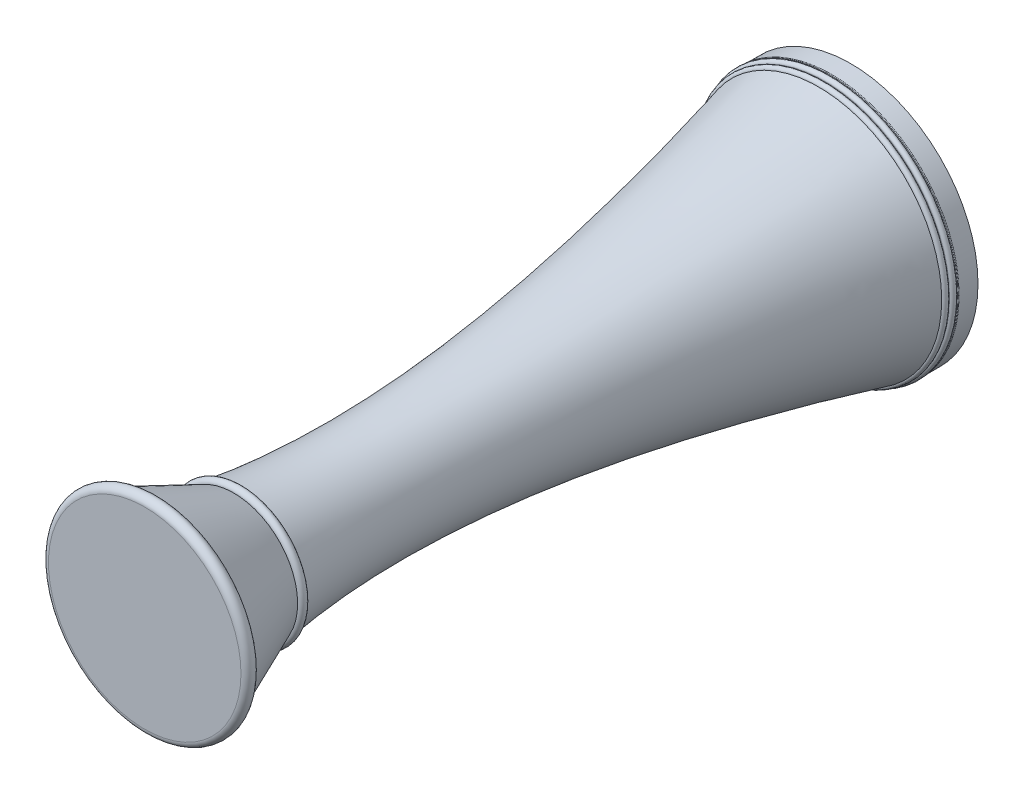
ISO-10303-21;
HEADER;
FILE_DESCRIPTION(('STEP AP214'),'2;1');
FILE_NAME('part.step','',(''),(''),'','','');
FILE_SCHEMA(('AUTOMOTIVE_DESIGN { 1 0 10303 214 1 1 1 1 }'));
ENDSEC;
DATA;
#1=APPLICATION_CONTEXT('core data for automotive mechanical design processes');
#2=APPLICATION_PROTOCOL_DEFINITION('international standard','automotive_design',2000,#1);
#3=PRODUCT_CONTEXT('',#1,'mechanical');
#4=PRODUCT('Part','Part','',(#3));
#5=PRODUCT_RELATED_PRODUCT_CATEGORY('part','',(#4));
#6=PRODUCT_DEFINITION_FORMATION('','',#4);
#7=PRODUCT_DEFINITION_CONTEXT('part definition',#1,'design');
#8=PRODUCT_DEFINITION('design','',#6,#7);
#9=PRODUCT_DEFINITION_SHAPE('','',#8);
#10=(LENGTH_UNIT() NAMED_UNIT(*) SI_UNIT(.MILLI.,.METRE.));
#11=(NAMED_UNIT(*) PLANE_ANGLE_UNIT() SI_UNIT($,.RADIAN.));
#12=(NAMED_UNIT(*) SI_UNIT($,.STERADIAN.) SOLID_ANGLE_UNIT());
#13=UNCERTAINTY_MEASURE_WITH_UNIT(LENGTH_MEASURE(1.E-05),#10,'distance_accuracy_value','');
#14=(GEOMETRIC_REPRESENTATION_CONTEXT(3) GLOBAL_UNCERTAINTY_ASSIGNED_CONTEXT((#13)) GLOBAL_UNIT_ASSIGNED_CONTEXT((#10,
#11,#12)) REPRESENTATION_CONTEXT('',''));
#15=CARTESIAN_POINT('',(0.,0.,0.));
#16=DIRECTION('',(0.,0.,1.));
#17=DIRECTION('',(1.,0.,0.));
#18=AXIS2_PLACEMENT_3D('',#15,#16,#17);
#19=CARTESIAN_POINT('',(0.,0.,0.75));
#20=DIRECTION('',(0.,0.,-1.));
#21=DIRECTION('',(-1.,0.,0.));
#22=AXIS2_PLACEMENT_3D('',#19,#20,#21);
#23=CYLINDRICAL_SURFACE('',#22,5.);
#24=CARTESIAN_POINT('',(0.,0.,0.75));
#25=DIRECTION('',(0.,0.,1.));
#26=DIRECTION('',(1.,0.,0.));
#27=AXIS2_PLACEMENT_3D('',#24,#25,#26);
#28=CIRCLE('',#27,5.);
#29=CARTESIAN_POINT('',(5.,0.,0.75));
#30=VERTEX_POINT('',#29);
#31=EDGE_CURVE('E51',#30,#30,#28,.T.);
#32=ORIENTED_EDGE('',*,*,#31,.F.);
#33=EDGE_LOOP('',(#32));
#34=FACE_BOUND('',#33,.T.);
#35=CARTESIAN_POINT('',(0.,0.,0.));
#36=DIRECTION('',(0.,0.,1.));
#37=DIRECTION('',(1.,0.,0.));
#38=AXIS2_PLACEMENT_3D('',#35,#36,#37);
#39=CIRCLE('',#38,5.);
#40=CARTESIAN_POINT('',(5.,0.,0.));
#41=VERTEX_POINT('',#40);
#42=EDGE_CURVE('E55',#41,#41,#39,.T.);
#43=ORIENTED_EDGE('',*,*,#42,.T.);
#44=EDGE_LOOP('',(#43));
#45=FACE_BOUND('',#44,.T.);
#46=ADVANCED_FACE('F41',(#34,#45),#23,.T.);
#47=CARTESIAN_POINT('',(0.,0.,0.));
#48=DIRECTION('',(0.,0.,1.));
#49=DIRECTION('',(1.,0.,0.));
#50=AXIS2_PLACEMENT_3D('',#47,#48,#49);
#51=PLANE('',#50);
#52=ORIENTED_EDGE('',*,*,#42,.F.);
#53=EDGE_LOOP('',(#52));
#54=FACE_BOUND('',#53,.T.);
#55=ADVANCED_FACE('F105',(#54),#51,.F.);
#56=CARTESIAN_POINT('',(0.,0.,0.769335629134094));
#57=DIRECTION('',(0.,0.,1.));
#58=DIRECTION('',(1.,0.,0.));
#59=AXIS2_PLACEMENT_3D('',#56,#57,#58);
#60=TOROIDAL_SURFACE('',#59,5.,0.0193356291340939);
#61=ORIENTED_EDGE('',*,*,#31,.T.);
#62=EDGE_LOOP('',(#61));
#63=FACE_BOUND('',#62,.T.);
#64=CARTESIAN_POINT('',(0.,0.,0.788671258268188));
#65=DIRECTION('',(0.,0.,1.));
#66=DIRECTION('',(1.,0.,0.));
#67=AXIS2_PLACEMENT_3D('',#64,#65,#66);
#68=CIRCLE('',#67,5.);
#69=CARTESIAN_POINT('',(5.,0.,0.788671258268188));
#70=VERTEX_POINT('',#69);
#71=EDGE_CURVE('E59',#70,#70,#68,.T.);
#72=ORIENTED_EDGE('',*,*,#71,.F.);
#73=EDGE_LOOP('',(#72));
#74=FACE_BOUND('',#73,.T.);
#75=ADVANCED_FACE('F102',(#63,#74),#60,.T.);
#76=CARTESIAN_POINT('',(5.,0.,0.788671258268188));
#77=DIRECTION('',(0.,0.,1.));
#78=DIRECTION('',(1.,0.,0.));
#79=AXIS2_PLACEMENT_3D('',#76,#77,#78);
#80=PLANE('',#79);
#81=CARTESIAN_POINT('',(0.,0.,0.788671258268188));
#82=DIRECTION('',(0.,0.,1.));
#83=DIRECTION('',(1.,0.,0.));
#84=AXIS2_PLACEMENT_3D('',#81,#82,#83);
#85=CIRCLE('',#84,4.91110899716843);
#86=CARTESIAN_POINT('',(4.91110899716843,0.,0.788671258268188));
#87=VERTEX_POINT('',#86);
#88=EDGE_CURVE('E47',#87,#87,#85,.T.);
#89=ORIENTED_EDGE('',*,*,#88,.F.);
#90=EDGE_LOOP('',(#89));
#91=FACE_BOUND('',#90,.T.);
#92=ORIENTED_EDGE('',*,*,#71,.T.);
#93=EDGE_LOOP('',(#92));
#94=FACE_BOUND('',#93,.T.);
#95=ADVANCED_FACE('F99',(#91,#94),#80,.T.);
#96=CARTESIAN_POINT('',(0.,0.,0.906680934140988));
#97=DIRECTION('',(0.,0.,1.));
#98=DIRECTION('',(1.,0.,0.));
#99=AXIS2_PLACEMENT_3D('',#96,#97,#98);
#100=TOROIDAL_SURFACE('',#99,4.91110899716843,0.118009675872801);
#101=ORIENTED_EDGE('',*,*,#88,.T.);
#102=EDGE_LOOP('',(#101));
#103=FACE_BOUND('',#102,.T.);
#104=CARTESIAN_POINT('',(0.,0.,1.02469061001379));
#105=DIRECTION('',(0.,0.,1.));
#106=DIRECTION('',(1.,0.,0.));
#107=AXIS2_PLACEMENT_3D('',#104,#105,#106);
#108=CIRCLE('',#107,4.91110899716843);
#109=CARTESIAN_POINT('',(4.91110899716843,0.,1.02469061001379));
#110=VERTEX_POINT('',#109);
#111=EDGE_CURVE('E63',#110,#110,#108,.T.);
#112=ORIENTED_EDGE('',*,*,#111,.F.);
#113=EDGE_LOOP('',(#112));
#114=FACE_BOUND('',#113,.T.);
#115=ADVANCED_FACE('F95',(#103,#114),#100,.T.);
#116=CARTESIAN_POINT('',(4.91110899716843,0.,1.02469061001379));
#117=DIRECTION('',(0.,0.,1.));
#118=DIRECTION('',(1.,0.,0.));
#119=AXIS2_PLACEMENT_3D('',#116,#117,#118);
#120=PLANE('',#119);
#121=CARTESIAN_POINT('',(0.,0.,1.02469061001379));
#122=DIRECTION('',(0.,0.,1.));
#123=DIRECTION('',(1.,0.,0.));
#124=AXIS2_PLACEMENT_3D('',#121,#122,#123);
#125=CIRCLE('',#124,4.83585708382199);
#126=CARTESIAN_POINT('',(4.83585708382199,0.,1.02469061001379));
#127=VERTEX_POINT('',#126);
#128=EDGE_CURVE('E10',#127,#127,#125,.T.);
#129=ORIENTED_EDGE('',*,*,#128,.F.);
#130=EDGE_LOOP('',(#129));
#131=FACE_BOUND('',#130,.T.);
#132=ORIENTED_EDGE('',*,*,#111,.T.);
#133=EDGE_LOOP('',(#132));
#134=FACE_BOUND('',#133,.T.);
#135=ADVANCED_FACE('F92',(#131,#134),#120,.T.);
#136=CARTESIAN_POINT('',(0.,0.,1.14388061007606));
#137=DIRECTION('',(0.,0.,1.));
#138=DIRECTION('',(1.,0.,0.));
#139=AXIS2_PLACEMENT_3D('',#136,#137,#138);
#140=TOROIDAL_SURFACE('',#139,4.83585708382199,0.119190000062271);
#141=ORIENTED_EDGE('',*,*,#128,.T.);
#142=EDGE_LOOP('',(#141));
#143=FACE_BOUND('',#142,.T.);
#144=CARTESIAN_POINT('',(0.,0.,1.26307061013833));
#145=DIRECTION('',(0.,0.,1.));
#146=DIRECTION('',(1.,0.,0.));
#147=AXIS2_PLACEMENT_3D('',#144,#145,#146);
#148=CIRCLE('',#147,4.83585708382199);
#149=CARTESIAN_POINT('',(4.83585708382199,0.,1.26307061013833));
#150=VERTEX_POINT('',#149);
#151=EDGE_CURVE('E66',#150,#150,#148,.T.);
#152=ORIENTED_EDGE('',*,*,#151,.F.);
#153=EDGE_LOOP('',(#152));
#154=FACE_BOUND('',#153,.T.);
#155=ADVANCED_FACE('F87',(#143,#154),#140,.T.);
#156=CARTESIAN_POINT('',(2.51023368738763,0.,23.9241649808584));
#157=CARTESIAN_POINT('',(1.21814434204223,0.,15.5202887879766));
#158=CARTESIAN_POINT('',(4.83585708382199,0.,1.26307061013833));
#159=B_SPLINE_CURVE_WITH_KNOTS('',2,(#156,#157,#158),.UNSPECIFIED.,.F.,.F.,(3,3),(0.,1.),.UNSPECIFIED.);
#160=CARTESIAN_POINT('',(0.,0.,23.9241649808584));
#161=DIRECTION('',(0.,0.,1.));
#162=AXIS1_PLACEMENT('',#160,#161);
#163=SURFACE_OF_REVOLUTION('',#159,#162);
#164=ORIENTED_EDGE('',*,*,#151,.T.);
#165=EDGE_LOOP('',(#164));
#166=FACE_BOUND('',#165,.T.);
#167=CARTESIAN_POINT('',(0.,0.,23.9241649808584));
#168=DIRECTION('',(0.,0.,1.));
#169=DIRECTION('',(1.,0.,0.));
#170=AXIS2_PLACEMENT_3D('',#167,#168,#169);
#171=CIRCLE('',#170,2.51023368738763);
#172=CARTESIAN_POINT('',(2.51023368738763,0.,23.9241649808584));
#173=VERTEX_POINT('',#172);
#174=EDGE_CURVE('E69',#173,#173,#171,.T.);
#175=ORIENTED_EDGE('',*,*,#174,.F.);
#176=EDGE_LOOP('',(#175));
#177=FACE_BOUND('',#176,.T.);
#178=ADVANCED_FACE('F82',(#166,#177),#163,.F.);
#179=CARTESIAN_POINT('',(0.,0.,24.090505915499));
#180=DIRECTION('',(0.,0.,1.));
#181=DIRECTION('',(1.,0.,0.));
#182=AXIS2_PLACEMENT_3D('',#179,#180,#181);
#183=TOROIDAL_SURFACE('',#182,2.51023368738763,0.166340934640553);
#184=ORIENTED_EDGE('',*,*,#174,.T.);
#185=EDGE_LOOP('',(#184));
#186=FACE_BOUND('',#185,.T.);
#187=CARTESIAN_POINT('',(0.,0.,24.2568468501395));
#188=DIRECTION('',(0.,0.,1.));
#189=DIRECTION('',(1.,0.,0.));
#190=AXIS2_PLACEMENT_3D('',#187,#188,#189);
#191=CIRCLE('',#190,2.51023368738763);
#192=CARTESIAN_POINT('',(2.51023368738763,0.,24.2568468501395));
#193=VERTEX_POINT('',#192);
#194=EDGE_CURVE('E72',#193,#193,#191,.T.);
#195=ORIENTED_EDGE('',*,*,#194,.F.);
#196=EDGE_LOOP('',(#195));
#197=FACE_BOUND('',#196,.T.);
#198=ADVANCED_FACE('F86',(#186,#197),#183,.T.);
#199=CARTESIAN_POINT('',(0.,0.,24.2568468501395));
#200=DIRECTION('',(0.,0.,1.));
#201=DIRECTION('',(1.,0.,0.));
#202=AXIS2_PLACEMENT_3D('',#199,#200,#201);
#203=CONICAL_SURFACE('',#202,2.51023368738763,0.401425727958696);
#204=CARTESIAN_POINT('',(0.,0.,27.2568468501395));
#205=DIRECTION('',(0.,0.,1.));
#206=DIRECTION('',(1.,0.,0.));
#207=AXIS2_PLACEMENT_3D('',#204,#205,#206);
#208=CIRCLE('',#207,3.78365813601645);
#209=CARTESIAN_POINT('',(3.78365813601645,0.,27.2568468501395));
#210=VERTEX_POINT('',#209);
#211=EDGE_CURVE('E230',#210,#210,#208,.T.);
#212=ORIENTED_EDGE('',*,*,#211,.F.);
#213=EDGE_LOOP('',(#212));
#214=FACE_BOUND('',#213,.T.);
#215=ORIENTED_EDGE('',*,*,#194,.T.);
#216=EDGE_LOOP('',(#215));
#217=FACE_BOUND('',#216,.T.);
#218=ADVANCED_FACE('F178',(#214,#217),#203,.T.);
#219=CARTESIAN_POINT('',(0.,0.,27.5071603670612));
#220=DIRECTION('',(0.,0.,1.));
#221=DIRECTION('',(1.,0.,0.));
#222=AXIS2_PLACEMENT_3D('',#219,#220,#221);
#223=TOROIDAL_SURFACE('',#222,3.78365813601645,0.250313516921662);
#224=ORIENTED_EDGE('',*,*,#211,.T.);
#225=EDGE_LOOP('',(#224));
#226=FACE_BOUND('',#225,.T.);
#227=CARTESIAN_POINT('',(0.,0.,27.7574738839828));
#228=DIRECTION('',(0.,0.,1.));
#229=DIRECTION('',(1.,0.,0.));
#230=AXIS2_PLACEMENT_3D('',#227,#228,#229);
#231=CIRCLE('',#230,3.78365813601645);
#232=CARTESIAN_POINT('',(3.78365813601645,0.,27.7574738839828));
#233=VERTEX_POINT('',#232);
#234=EDGE_CURVE('E228',#233,#233,#231,.T.);
#235=ORIENTED_EDGE('',*,*,#234,.F.);
#236=EDGE_LOOP('',(#235));
#237=FACE_BOUND('',#236,.T.);
#238=ADVANCED_FACE('F188',(#226,#237),#223,.T.);
#239=CARTESIAN_POINT('',(3.78365813601645,0.,27.7574738839828));
#240=DIRECTION('',(0.,0.,1.));
#241=DIRECTION('',(1.,0.,0.));
#242=AXIS2_PLACEMENT_3D('',#239,#240,#241);
#243=PLANE('',#242);
#244=ORIENTED_EDGE('',*,*,#234,.T.);
#245=EDGE_LOOP('',(#244));
#246=FACE_BOUND('',#245,.T.);
#247=ADVANCED_FACE('F198',(#246),#243,.T.);
#248=CLOSED_SHELL('',(#46,#55,#75,#95,#115,#135,#155,#178,#198,#218,#238,#247));
#249=MANIFOLD_SOLID_BREP('B2',#248);
#250=ADVANCED_BREP_SHAPE_REPRESENTATION('',(#18,#249),#14);
#251=SHAPE_DEFINITION_REPRESENTATION(#9,#250);
ENDSEC;
END-ISO-10303-21;
